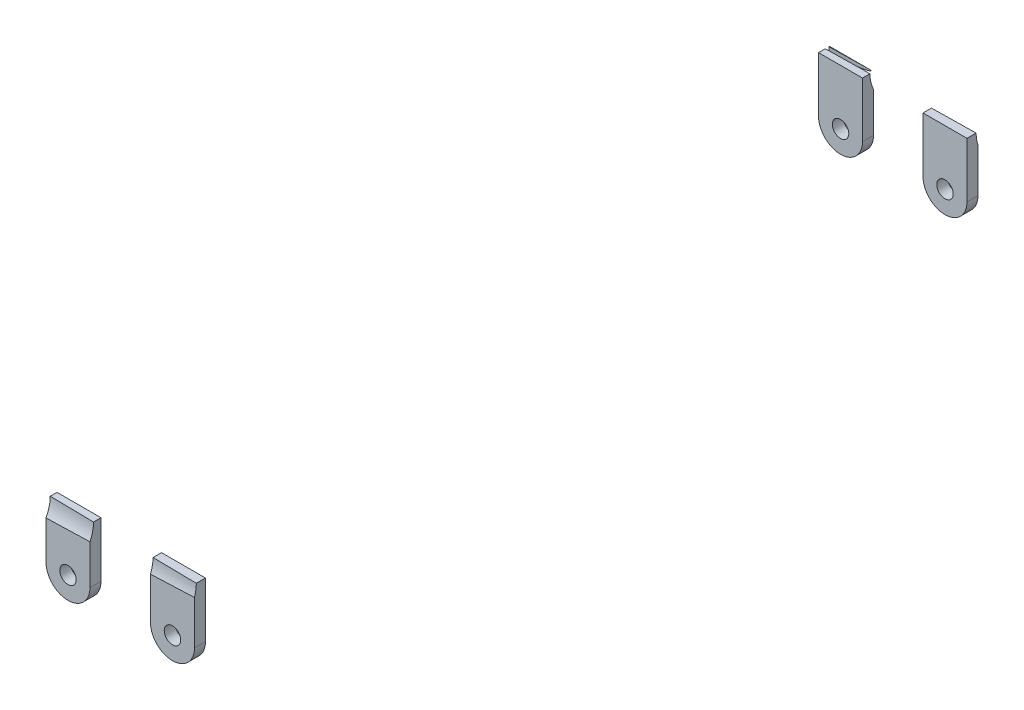
ISO-10303-21;
HEADER;
FILE_DESCRIPTION(('STEP AP214'),'2;1');
FILE_NAME('part.step','',(''),(''),'','','');
FILE_SCHEMA(('AUTOMOTIVE_DESIGN { 1 0 10303 214 1 1 1 1 }'));
ENDSEC;
DATA;
#1=APPLICATION_CONTEXT('core data for automotive mechanical design processes');
#2=APPLICATION_PROTOCOL_DEFINITION('international standard','automotive_design',2000,#1);
#3=PRODUCT_CONTEXT('',#1,'mechanical');
#4=PRODUCT('Part','Part','',(#3));
#5=PRODUCT_RELATED_PRODUCT_CATEGORY('part','',(#4));
#6=PRODUCT_DEFINITION_FORMATION('','',#4);
#7=PRODUCT_DEFINITION_CONTEXT('part definition',#1,'design');
#8=PRODUCT_DEFINITION('design','',#6,#7);
#9=PRODUCT_DEFINITION_SHAPE('','',#8);
#10=(LENGTH_UNIT() NAMED_UNIT(*) SI_UNIT(.MILLI.,.METRE.));
#11=(NAMED_UNIT(*) PLANE_ANGLE_UNIT() SI_UNIT($,.RADIAN.));
#12=(NAMED_UNIT(*) SI_UNIT($,.STERADIAN.) SOLID_ANGLE_UNIT());
#13=UNCERTAINTY_MEASURE_WITH_UNIT(LENGTH_MEASURE(1.E-05),#10,'distance_accuracy_value','');
#14=(GEOMETRIC_REPRESENTATION_CONTEXT(3) GLOBAL_UNCERTAINTY_ASSIGNED_CONTEXT((#13)) GLOBAL_UNIT_ASSIGNED_CONTEXT((#10,
#11,#12)) REPRESENTATION_CONTEXT('',''));
#15=CARTESIAN_POINT('',(0.,0.,0.));
#16=DIRECTION('',(0.,0.,1.));
#17=DIRECTION('',(1.,0.,0.));
#18=AXIS2_PLACEMENT_3D('',#15,#16,#17);
#19=CARTESIAN_POINT('',(-0.0344409514116402,179.851831387508,142.5));
#20=DIRECTION('',(-0.000191496247296726,0.999999981664593,0.));
#21=DIRECTION('',(-0.999999981664593,-0.000191496247296726,0.));
#22=AXIS2_PLACEMENT_3D('',#19,#20,#21);
#23=PLANE('',#22);
#24=DIRECTION('',(0.,0.,-1.));
#25=VECTOR('',#24,1.);
#26=CARTESIAN_POINT('',(1019.,180.046972662395,142.5));
#27=LINE('',#26,#25);
#28=CARTESIAN_POINT('',(1019.,180.046972662395,141.213051029782));
#29=VERTEX_POINT('',#28);
#30=CARTESIAN_POINT('',(1019.,180.046972662395,138.5));
#31=VERTEX_POINT('',#30);
#32=EDGE_CURVE('E124',#29,#31,#27,.T.);
#33=ORIENTED_EDGE('',*,*,#32,.T.);
#34=DIRECTION('',(-0.999999981664593,-0.000191496247296726,0.));
#35=VECTOR('',#34,1.);
#36=CARTESIAN_POINT('',(-0.0344409514116402,179.851831387508,138.5));
#37=LINE('',#36,#35);
#38=CARTESIAN_POINT('',(1003.,180.043908722382,138.5));
#39=VERTEX_POINT('',#38);
#40=EDGE_CURVE('E128',#31,#39,#37,.T.);
#41=ORIENTED_EDGE('',*,*,#40,.T.);
#42=DIRECTION('',(0.,0.,-1.));
#43=VECTOR('',#42,1.);
#44=CARTESIAN_POINT('',(1003.,180.043908722382,142.5));
#45=LINE('',#44,#43);
#46=CARTESIAN_POINT('',(1003.,180.043908722382,140.957704393656));
#47=VERTEX_POINT('',#46);
#48=EDGE_CURVE('E137',#47,#39,#45,.T.);
#49=ORIENTED_EDGE('',*,*,#48,.F.);
#50=CARTESIAN_POINT('',(1019.001,180.046972853891,141.213066988947));
#51=CARTESIAN_POINT('',(1016.334,180.04646213339,141.170503896537));
#52=CARTESIAN_POINT('',(1013.667,180.045951412889,141.127940804128));
#53=CARTESIAN_POINT('',(1008.333,180.044929971887,141.04281461931));
#54=CARTESIAN_POINT('',(1005.666,180.044419251386,141.000251526901));
#55=CARTESIAN_POINT('',(1002.999,180.043908530885,140.957688434491));
#56=B_SPLINE_CURVE_WITH_KNOTS('',3,(#50,#51,#52,#53,#54,#55),.UNSPECIFIED.,.F.,.F.,(4,2,4),(0.,
8.00201898892002,16.00403797784),.UNSPECIFIED.);
#57=EDGE_CURVE('E108',#29,#47,#56,.T.);
#58=ORIENTED_EDGE('',*,*,#57,.F.);
#59=EDGE_LOOP('',(#33,#41,#49,#58));
#60=FACE_BOUND('',#59,.T.);
#61=ADVANCED_FACE('F50',(#60),#23,.T.);
#62=CARTESIAN_POINT('',(1019.,0.,142.5));
#63=DIRECTION('',(1.,0.,0.));
#64=DIRECTION('',(0.,0.,1.));
#65=AXIS2_PLACEMENT_3D('',#62,#63,#64);
#66=PLANE('',#65);
#67=DIRECTION('',(0.,1.,0.));
#68=VECTOR('',#67,1.);
#69=CARTESIAN_POINT('',(1019.,0.,142.5));
#70=LINE('',#69,#68);
#71=CARTESIAN_POINT('',(1019.,160.,142.5));
#72=VERTEX_POINT('',#71);
#73=CARTESIAN_POINT('',(1019.,174.471738830205,142.5));
#74=VERTEX_POINT('',#73);
#75=EDGE_CURVE('E102',#72,#74,#70,.T.);
#76=ORIENTED_EDGE('',*,*,#75,.F.);
#77=DIRECTION('',(0.,0.,-1.));
#78=VECTOR('',#77,1.);
#79=CARTESIAN_POINT('',(1019.,160.,142.5));
#80=LINE('',#79,#78);
#81=CARTESIAN_POINT('',(1019.,160.,138.5));
#82=VERTEX_POINT('',#81);
#83=EDGE_CURVE('E112',#72,#82,#80,.T.);
#84=ORIENTED_EDGE('',*,*,#83,.T.);
#85=DIRECTION('',(0.,1.,0.));
#86=VECTOR('',#85,1.);
#87=CARTESIAN_POINT('',(1019.,0.,138.5));
#88=LINE('',#87,#86);
#89=EDGE_CURVE('E131',#82,#31,#88,.T.);
#90=ORIENTED_EDGE('',*,*,#89,.T.);
#91=ORIENTED_EDGE('',*,*,#32,.F.);
#92=CARTESIAN_POINT('',(1019.,180.042097589936,153.914667288973));
#93=DIRECTION('',(-1.,0.,0.));
#94=DIRECTION('',(0.,-0.0107531886792747,-0.9999421827952));
#95=AXIS2_PLACEMENT_3D('',#92,#93,#94);
#96=ELLIPSE('',#95,12.7016173954027,12.7);
#97=EDGE_CURVE('E69',#74,#29,#96,.F.);
#98=ORIENTED_EDGE('',*,*,#97,.F.);
#99=EDGE_LOOP('',(#76,#84,#90,#91,#98));
#100=FACE_BOUND('',#99,.T.);
#101=ADVANCED_FACE('F149',(#100),#66,.T.);
#102=CARTESIAN_POINT('',(1011.,160.,142.5));
#103=DIRECTION('',(0.,0.,-1.));
#104=DIRECTION('',(1.,0.,0.));
#105=AXIS2_PLACEMENT_3D('',#102,#103,#104);
#106=CYLINDRICAL_SURFACE('',#105,7.99999999999999);
#107=CARTESIAN_POINT('',(1011.,160.,138.5));
#108=DIRECTION('',(0.,0.,-1.));
#109=DIRECTION('',(-1.,0.,0.));
#110=AXIS2_PLACEMENT_3D('',#107,#108,#109);
#111=CIRCLE('',#110,7.99999999999999);
#112=CARTESIAN_POINT('',(1003.,160.,138.5));
#113=VERTEX_POINT('',#112);
#114=EDGE_CURVE('E126',#82,#113,#111,.T.);
#115=ORIENTED_EDGE('',*,*,#114,.F.);
#116=ORIENTED_EDGE('',*,*,#83,.F.);
#117=CARTESIAN_POINT('',(1011.,160.,142.5));
#118=DIRECTION('',(0.,0.,-1.));
#119=DIRECTION('',(-1.,0.,0.));
#120=AXIS2_PLACEMENT_3D('',#117,#118,#119);
#121=CIRCLE('',#120,7.99999999999999);
#122=CARTESIAN_POINT('',(1003.,160.,142.5));
#123=VERTEX_POINT('',#122);
#124=EDGE_CURVE('E103',#72,#123,#121,.T.);
#125=ORIENTED_EDGE('',*,*,#124,.T.);
#126=DIRECTION('',(0.,0.,-1.));
#127=VECTOR('',#126,1.);
#128=CARTESIAN_POINT('',(1003.,160.,142.5));
#129=LINE('',#128,#127);
#130=EDGE_CURVE('E115',#123,#113,#129,.T.);
#131=ORIENTED_EDGE('',*,*,#130,.T.);
#132=EDGE_LOOP('',(#115,#116,#125,#131));
#133=FACE_BOUND('',#132,.T.);
#134=ADVANCED_FACE('F164',(#133),#106,.T.);
#135=CARTESIAN_POINT('',(1003.,1.1111143132034E-11,142.5));
#136=DIRECTION('',(-1.,0.,0.));
#137=DIRECTION('',(0.,-1.,0.));
#138=AXIS2_PLACEMENT_3D('',#135,#136,#137);
#139=PLANE('',#138);
#140=ORIENTED_EDGE('',*,*,#48,.T.);
#141=DIRECTION('',(0.,-1.,0.));
#142=VECTOR('',#141,1.);
#143=CARTESIAN_POINT('',(1003.,1.1111143132034E-11,138.5));
#144=LINE('',#143,#142);
#145=EDGE_CURVE('E60',#39,#113,#144,.T.);
#146=ORIENTED_EDGE('',*,*,#145,.T.);
#147=ORIENTED_EDGE('',*,*,#130,.F.);
#148=DIRECTION('',(0.,-1.,0.));
#149=VECTOR('',#148,1.);
#150=CARTESIAN_POINT('',(1003.,1.1111143132034E-11,142.5));
#151=LINE('',#150,#149);
#152=CARTESIAN_POINT('',(1003.,173.973740307988,142.5));
#153=VERTEX_POINT('',#152);
#154=EDGE_CURVE('E54',#153,#123,#151,.T.);
#155=ORIENTED_EDGE('',*,*,#154,.F.);
#156=CARTESIAN_POINT('',(1003.,180.039351641896,153.659320771818));
#157=DIRECTION('',(1.,0.,0.));
#158=DIRECTION('',(0.,-0.0107531886785806,-0.999942182795207));
#159=AXIS2_PLACEMENT_3D('',#156,#157,#158);
#160=ELLIPSE('',#159,12.7016173954027,12.7);
#161=EDGE_CURVE('E106',#47,#153,#160,.F.);
#162=ORIENTED_EDGE('',*,*,#161,.F.);
#163=EDGE_LOOP('',(#140,#146,#147,#155,#162));
#164=FACE_BOUND('',#163,.T.);
#165=ADVANCED_FACE('F52',(#164),#139,.T.);
#166=CARTESIAN_POINT('',(1011.,160.,142.5));
#167=DIRECTION('',(0.,0.,-1.));
#168=DIRECTION('',(1.,0.,0.));
#169=AXIS2_PLACEMENT_3D('',#166,#167,#168);
#170=CYLINDRICAL_SURFACE('',#169,3.00000000000017);
#171=CARTESIAN_POINT('',(1011.,160.,142.5));
#172=DIRECTION('',(0.,0.,-1.));
#173=DIRECTION('',(-1.,0.,0.));
#174=AXIS2_PLACEMENT_3D('',#171,#172,#173);
#175=CIRCLE('',#174,3.00000000000017);
#176=CARTESIAN_POINT('',(1008.,160.,142.5));
#177=VERTEX_POINT('',#176);
#178=EDGE_CURVE('E104',#177,#177,#175,.T.);
#179=ORIENTED_EDGE('',*,*,#178,.F.);
#180=EDGE_LOOP('',(#179));
#181=FACE_BOUND('',#180,.T.);
#182=CARTESIAN_POINT('',(1011.,160.,138.5));
#183=DIRECTION('',(0.,0.,-1.));
#184=DIRECTION('',(-1.,0.,0.));
#185=AXIS2_PLACEMENT_3D('',#182,#183,#184);
#186=CIRCLE('',#185,3.00000000000017);
#187=CARTESIAN_POINT('',(1008.,160.,138.5));
#188=VERTEX_POINT('',#187);
#189=EDGE_CURVE('E12',#188,#188,#186,.T.);
#190=ORIENTED_EDGE('',*,*,#189,.T.);
#191=EDGE_LOOP('',(#190));
#192=FACE_BOUND('',#191,.T.);
#193=ADVANCED_FACE('F153',(#181,#192),#170,.F.);
#194=CARTESIAN_POINT('',(0.,0.,142.5));
#195=DIRECTION('',(0.,0.,1.));
#196=DIRECTION('',(-1.,0.,0.));
#197=AXIS2_PLACEMENT_3D('',#194,#195,#196);
#198=PLANE('',#197);
#199=ORIENTED_EDGE('',*,*,#154,.T.);
#200=ORIENTED_EDGE('',*,*,#124,.F.);
#201=ORIENTED_EDGE('',*,*,#75,.T.);
#202=CARTESIAN_POINT('',(303.757518300032,179.919346421737,142.5));
#203=DIRECTION('',(0.,0.,-1.));
#204=DIRECTION('',(-0.999999985272988,-0.000171621750010428,0.));
#205=AXIS2_PLACEMENT_3D('',#202,#203,#204);
#206=ELLIPSE('',#205,795.882711033291,12.7);
#207=EDGE_CURVE('E94',#153,#74,#206,.F.);
#208=ORIENTED_EDGE('',*,*,#207,.F.);
#209=EDGE_LOOP('',(#199,#200,#201,#208));
#210=FACE_BOUND('',#209,.T.);
#211=ORIENTED_EDGE('',*,*,#178,.T.);
#212=EDGE_LOOP('',(#211));
#213=FACE_BOUND('',#212,.T.);
#214=ADVANCED_FACE('F97',(#210,#213),#198,.T.);
#215=CARTESIAN_POINT('',(0.,0.,138.5));
#216=DIRECTION('',(0.,0.,1.));
#217=DIRECTION('',(-1.,0.,0.));
#218=AXIS2_PLACEMENT_3D('',#215,#216,#217);
#219=PLANE('',#218);
#220=ORIENTED_EDGE('',*,*,#89,.F.);
#221=ORIENTED_EDGE('',*,*,#114,.T.);
#222=ORIENTED_EDGE('',*,*,#145,.F.);
#223=ORIENTED_EDGE('',*,*,#40,.F.);
#224=EDGE_LOOP('',(#220,#221,#222,#223));
#225=FACE_BOUND('',#224,.T.);
#226=ORIENTED_EDGE('',*,*,#189,.F.);
#227=EDGE_LOOP('',(#226));
#228=FACE_BOUND('',#227,.T.);
#229=ADVANCED_FACE('F152',(#225,#228),#219,.F.);
#230=CARTESIAN_POINT('',(1400.,180.107485477653,159.995106228733));
#231=DIRECTION('',(-0.999872662248254,-0.000171599898609785,-0.015957125118991));
#232=DIRECTION('',(0.015957125353932,0.,-0.999872676969642));
#233=AXIS2_PLACEMENT_3D('',#230,#231,#232);
#234=CYLINDRICAL_SURFACE('',#233,12.7);
#235=ORIENTED_EDGE('',*,*,#97,.T.);
#236=ORIENTED_EDGE('',*,*,#57,.T.);
#237=ORIENTED_EDGE('',*,*,#161,.T.);
#238=ORIENTED_EDGE('',*,*,#207,.T.);
#239=EDGE_LOOP('',(#235,#236,#237,#238));
#240=FACE_BOUND('',#239,.T.);
#241=ADVANCED_FACE('F107',(#240),#234,.F.);
#242=CLOSED_SHELL('',(#61,#101,#134,#165,#193,#214,#229,#241));
#243=MANIFOLD_SOLID_BREP('B2',#242);
#244=CARTESIAN_POINT('',(-0.0344409514116402,179.851831387508,142.5));
#245=DIRECTION('',(-0.000191496247296726,0.999999981664593,0.));
#246=DIRECTION('',(-0.999999981664593,-0.000191496247296726,0.));
#247=AXIS2_PLACEMENT_3D('',#244,#245,#246);
#248=PLANE('',#247);
#249=DIRECTION('',(0.,0.,-1.));
#250=VECTOR('',#249,1.);
#251=CARTESIAN_POINT('',(1057.,180.054249519925,142.5));
#252=LINE('',#251,#250);
#253=CARTESIAN_POINT('',(1057.,180.054249519925,141.819499322495));
#254=VERTEX_POINT('',#253);
#255=CARTESIAN_POINT('',(1057.,180.054249519925,138.5));
#256=VERTEX_POINT('',#255);
#257=EDGE_CURVE('E290',#254,#256,#252,.T.);
#258=ORIENTED_EDGE('',*,*,#257,.T.);
#259=DIRECTION('',(-0.999999981664593,-0.000191496247296726,0.));
#260=VECTOR('',#259,1.);
#261=CARTESIAN_POINT('',(-0.0344409514116402,179.851831387508,138.5));
#262=LINE('',#261,#260);
#263=CARTESIAN_POINT('',(1041.,180.051185579912,138.5));
#264=VERTEX_POINT('',#263);
#265=EDGE_CURVE('E298',#256,#264,#262,.T.);
#266=ORIENTED_EDGE('',*,*,#265,.T.);
#267=DIRECTION('',(0.,0.,-1.));
#268=VECTOR('',#267,1.);
#269=CARTESIAN_POINT('',(1041.,180.051185579912,142.5));
#270=LINE('',#269,#268);
#271=CARTESIAN_POINT('',(1041.,180.051185579912,141.564152667457));
#272=VERTEX_POINT('',#271);
#273=EDGE_CURVE('E309',#272,#264,#270,.T.);
#274=ORIENTED_EDGE('',*,*,#273,.F.);
#275=CARTESIAN_POINT('',(1057.001,180.054249711421,141.819515281662));
#276=CARTESIAN_POINT('',(1054.334,180.053738990921,141.7769521861));
#277=CARTESIAN_POINT('',(1051.667,180.05322827042,141.734389090538));
#278=CARTESIAN_POINT('',(1046.333,180.052206829418,141.649262899415));
#279=CARTESIAN_POINT('',(1043.666,180.051696108917,141.606699803853));
#280=CARTESIAN_POINT('',(1040.999,180.051185388416,141.564136708291));
#281=B_SPLINE_CURVE_WITH_KNOTS('',3,(#275,#276,#277,#278,#279,#280),.UNSPECIFIED.,.F.,.F.,(4,2,
4),(0.,8.00201898907094,16.0040379781419),.UNSPECIFIED.);
#282=EDGE_CURVE('E295',#254,#272,#281,.T.);
#283=ORIENTED_EDGE('',*,*,#282,.F.);
#284=EDGE_LOOP('',(#258,#266,#274,#283));
#285=FACE_BOUND('',#284,.T.);
#286=ADVANCED_FACE('F245',(#285),#248,.T.);
#287=CARTESIAN_POINT('',(1057.,0.,142.5));
#288=DIRECTION('',(1.,0.,0.));
#289=DIRECTION('',(0.,0.,1.));
#290=AXIS2_PLACEMENT_3D('',#287,#288,#289);
#291=PLANE('',#290);
#292=DIRECTION('',(0.,1.,0.));
#293=VECTOR('',#292,1.);
#294=CARTESIAN_POINT('',(1057.,0.,142.5));
#295=LINE('',#294,#293);
#296=CARTESIAN_POINT('',(1057.,160.,142.5));
#297=VERTEX_POINT('',#296);
#298=CARTESIAN_POINT('',(1057.,175.947417676455,142.5));
#299=VERTEX_POINT('',#298);
#300=EDGE_CURVE('E329',#297,#299,#295,.T.);
#301=ORIENTED_EDGE('',*,*,#300,.F.);
#302=DIRECTION('',(0.,0.,-1.));
#303=VECTOR('',#302,1.);
#304=CARTESIAN_POINT('',(1057.,160.,142.5));
#305=LINE('',#304,#303);
#306=CARTESIAN_POINT('',(1057.,160.,138.5));
#307=VERTEX_POINT('',#306);
#308=EDGE_CURVE('E253',#297,#307,#305,.T.);
#309=ORIENTED_EDGE('',*,*,#308,.T.);
#310=DIRECTION('',(0.,1.,0.));
#311=VECTOR('',#310,1.);
#312=CARTESIAN_POINT('',(1057.,0.,138.5));
#313=LINE('',#312,#311);
#314=EDGE_CURVE('E286',#307,#256,#313,.T.);
#315=ORIENTED_EDGE('',*,*,#314,.T.);
#316=ORIENTED_EDGE('',*,*,#257,.F.);
#317=CARTESIAN_POINT('',(1057.,180.048619216533,154.521115267217));
#318=DIRECTION('',(-1.,0.,0.));
#319=DIRECTION('',(0.,-0.0107531886792747,-0.9999421827952));
#320=AXIS2_PLACEMENT_3D('',#317,#318,#319);
#321=ELLIPSE('',#320,12.7016173954027,12.7);
#322=EDGE_CURVE('E339',#299,#254,#321,.F.);
#323=ORIENTED_EDGE('',*,*,#322,.F.);
#324=EDGE_LOOP('',(#301,#309,#315,#316,#323));
#325=FACE_BOUND('',#324,.T.);
#326=ADVANCED_FACE('F247',(#325),#291,.T.);
#327=CARTESIAN_POINT('',(1049.,160.,142.5));
#328=DIRECTION('',(0.,0.,-1.));
#329=DIRECTION('',(1.,0.,0.));
#330=AXIS2_PLACEMENT_3D('',#327,#328,#329);
#331=CYLINDRICAL_SURFACE('',#330,7.99999999999999);
#332=CARTESIAN_POINT('',(1049.,160.,138.5));
#333=DIRECTION('',(0.,0.,-1.));
#334=DIRECTION('',(-1.,0.,0.));
#335=AXIS2_PLACEMENT_3D('',#332,#333,#334);
#336=CIRCLE('',#335,7.99999999999999);
#337=CARTESIAN_POINT('',(1041.,160.,138.5));
#338=VERTEX_POINT('',#337);
#339=EDGE_CURVE('E294',#307,#338,#336,.T.);
#340=ORIENTED_EDGE('',*,*,#339,.F.);
#341=ORIENTED_EDGE('',*,*,#308,.F.);
#342=CARTESIAN_POINT('',(1049.,160.,142.5));
#343=DIRECTION('',(0.,0.,-1.));
#344=DIRECTION('',(-1.,0.,0.));
#345=AXIS2_PLACEMENT_3D('',#342,#343,#344);
#346=CIRCLE('',#345,7.99999999999999);
#347=CARTESIAN_POINT('',(1041.,160.,142.5));
#348=VERTEX_POINT('',#347);
#349=EDGE_CURVE('E322',#297,#348,#346,.T.);
#350=ORIENTED_EDGE('',*,*,#349,.T.);
#351=DIRECTION('',(0.,0.,-1.));
#352=VECTOR('',#351,1.);
#353=CARTESIAN_POINT('',(1041.,160.,142.5));
#354=LINE('',#353,#352);
#355=EDGE_CURVE('E312',#348,#338,#354,.T.);
#356=ORIENTED_EDGE('',*,*,#355,.T.);
#357=EDGE_LOOP('',(#340,#341,#350,#356));
#358=FACE_BOUND('',#357,.T.);
#359=ADVANCED_FACE('F321',(#358),#331,.T.);
#360=CARTESIAN_POINT('',(1041.,1.15279185265997E-11,142.5));
#361=DIRECTION('',(-1.,0.,0.));
#362=DIRECTION('',(0.,-1.,0.));
#363=AXIS2_PLACEMENT_3D('',#360,#361,#362);
#364=PLANE('',#363);
#365=ORIENTED_EDGE('',*,*,#273,.T.);
#366=DIRECTION('',(0.,-1.,0.));
#367=VECTOR('',#366,1.);
#368=CARTESIAN_POINT('',(1041.,1.15279185265997E-11,138.5));
#369=LINE('',#368,#367);
#370=EDGE_CURVE('E301',#264,#338,#369,.T.);
#371=ORIENTED_EDGE('',*,*,#370,.T.);
#372=ORIENTED_EDGE('',*,*,#355,.F.);
#373=DIRECTION('',(0.,-1.,0.));
#374=VECTOR('',#373,1.);
#375=CARTESIAN_POINT('',(1041.,1.15279185265997E-11,142.5));
#376=LINE('',#375,#374);
#377=CARTESIAN_POINT('',(1041.,175.261289280109,142.5));
#378=VERTEX_POINT('',#377);
#379=EDGE_CURVE('E266',#378,#348,#376,.T.);
#380=ORIENTED_EDGE('',*,*,#379,.F.);
#381=CARTESIAN_POINT('',(1041.,180.045873268492,154.265768750062));
#382=DIRECTION('',(1.,0.,0.));
#383=DIRECTION('',(0.,-0.0107531886785809,-0.999942182795207));
#384=AXIS2_PLACEMENT_3D('',#381,#382,#383);
#385=ELLIPSE('',#384,12.7016173954027,12.7);
#386=EDGE_CURVE('E417',#272,#378,#385,.F.);
#387=ORIENTED_EDGE('',*,*,#386,.F.);
#388=EDGE_LOOP('',(#365,#371,#372,#380,#387));
#389=FACE_BOUND('',#388,.T.);
#390=ADVANCED_FACE('F350',(#389),#364,.T.);
#391=CARTESIAN_POINT('',(1049.,160.,142.5));
#392=DIRECTION('',(0.,0.,-1.));
#393=DIRECTION('',(1.,0.,0.));
#394=AXIS2_PLACEMENT_3D('',#391,#392,#393);
#395=CYLINDRICAL_SURFACE('',#394,2.99999999999971);
#396=CARTESIAN_POINT('',(1049.,160.,142.5));
#397=DIRECTION('',(0.,0.,-1.));
#398=DIRECTION('',(-1.,0.,0.));
#399=AXIS2_PLACEMENT_3D('',#396,#397,#398);
#400=CIRCLE('',#399,2.99999999999971);
#401=CARTESIAN_POINT('',(1046.,160.,142.5));
#402=VERTEX_POINT('',#401);
#403=EDGE_CURVE('E310',#402,#402,#400,.T.);
#404=ORIENTED_EDGE('',*,*,#403,.F.);
#405=EDGE_LOOP('',(#404));
#406=FACE_BOUND('',#405,.T.);
#407=CARTESIAN_POINT('',(1049.,160.,138.5));
#408=DIRECTION('',(0.,0.,-1.));
#409=DIRECTION('',(-1.,0.,0.));
#410=AXIS2_PLACEMENT_3D('',#407,#408,#409);
#411=CIRCLE('',#410,2.99999999999971);
#412=CARTESIAN_POINT('',(1046.,160.,138.5));
#413=VERTEX_POINT('',#412);
#414=EDGE_CURVE('E305',#413,#413,#411,.T.);
#415=ORIENTED_EDGE('',*,*,#414,.T.);
#416=EDGE_LOOP('',(#415));
#417=FACE_BOUND('',#416,.T.);
#418=ADVANCED_FACE('F348',(#406,#417),#395,.F.);
#419=CARTESIAN_POINT('',(0.,0.,142.5));
#420=DIRECTION('',(0.,0.,1.));
#421=DIRECTION('',(-1.,0.,0.));
#422=AXIS2_PLACEMENT_3D('',#419,#420,#421);
#423=PLANE('',#422);
#424=ORIENTED_EDGE('',*,*,#379,.T.);
#425=ORIENTED_EDGE('',*,*,#349,.F.);
#426=ORIENTED_EDGE('',*,*,#300,.T.);
#427=CARTESIAN_POINT('',(303.757518300032,179.919346421737,142.5));
#428=DIRECTION('',(0.,0.,-1.));
#429=DIRECTION('',(-0.999999985272988,-0.000171621750010428,0.));
#430=AXIS2_PLACEMENT_3D('',#427,#428,#429);
#431=ELLIPSE('',#430,795.882711033291,12.7);
#432=EDGE_CURVE('E48',#378,#299,#431,.F.);
#433=ORIENTED_EDGE('',*,*,#432,.F.);
#434=EDGE_LOOP('',(#424,#425,#426,#433));
#435=FACE_BOUND('',#434,.T.);
#436=ORIENTED_EDGE('',*,*,#403,.T.);
#437=EDGE_LOOP('',(#436));
#438=FACE_BOUND('',#437,.T.);
#439=ADVANCED_FACE('F383',(#435,#438),#423,.T.);
#440=CARTESIAN_POINT('',(0.,0.,138.5));
#441=DIRECTION('',(0.,0.,1.));
#442=DIRECTION('',(-1.,0.,0.));
#443=AXIS2_PLACEMENT_3D('',#440,#441,#442);
#444=PLANE('',#443);
#445=ORIENTED_EDGE('',*,*,#314,.F.);
#446=ORIENTED_EDGE('',*,*,#339,.T.);
#447=ORIENTED_EDGE('',*,*,#370,.F.);
#448=ORIENTED_EDGE('',*,*,#265,.F.);
#449=EDGE_LOOP('',(#445,#446,#447,#448));
#450=FACE_BOUND('',#449,.T.);
#451=ORIENTED_EDGE('',*,*,#414,.F.);
#452=EDGE_LOOP('',(#451));
#453=FACE_BOUND('',#452,.T.);
#454=ADVANCED_FACE('F299',(#450,#453),#444,.F.);
#455=CARTESIAN_POINT('',(1400.,180.107485477653,159.995106228733));
#456=DIRECTION('',(-0.999872662248254,-0.000171599898609785,-0.015957125118991));
#457=DIRECTION('',(0.015957125353932,0.,-0.999872676969642));
#458=AXIS2_PLACEMENT_3D('',#455,#456,#457);
#459=CYLINDRICAL_SURFACE('',#458,12.7);
#460=ORIENTED_EDGE('',*,*,#322,.T.);
#461=ORIENTED_EDGE('',*,*,#282,.T.);
#462=ORIENTED_EDGE('',*,*,#386,.T.);
#463=ORIENTED_EDGE('',*,*,#432,.T.);
#464=EDGE_LOOP('',(#460,#461,#462,#463));
#465=FACE_BOUND('',#464,.T.);
#466=ADVANCED_FACE('F341',(#465),#459,.F.);
#467=CLOSED_SHELL('',(#286,#326,#359,#390,#418,#439,#454,#466));
#468=MANIFOLD_SOLID_BREP('B6',#467);
#469=CARTESIAN_POINT('',(-0.0344409514116402,179.851831387508,-142.5));
#470=DIRECTION('',(-0.000191496247296726,0.999999981664593,0.));
#471=DIRECTION('',(-0.999999981664593,-0.000191496247296726,0.));
#472=AXIS2_PLACEMENT_3D('',#469,#470,#471);
#473=PLANE('',#472);
#474=DIRECTION('',(0.,0.,1.));
#475=VECTOR('',#474,1.);
#476=CARTESIAN_POINT('',(1019.,180.046972662395,-142.5));
#477=LINE('',#476,#475);
#478=CARTESIAN_POINT('',(1019.,180.046972662395,-141.213051029782));
#479=VERTEX_POINT('',#478);
#480=CARTESIAN_POINT('',(1019.,180.046972662395,-138.5));
#481=VERTEX_POINT('',#480);
#482=EDGE_CURVE('E513',#479,#481,#477,.T.);
#483=ORIENTED_EDGE('',*,*,#482,.F.);
#484=CARTESIAN_POINT('',(1019.001,180.046972853891,-141.213066988947));
#485=CARTESIAN_POINT('',(1016.334,180.04646213339,-141.170503896537));
#486=CARTESIAN_POINT('',(1013.667,180.045951412889,-141.127940804128));
#487=CARTESIAN_POINT('',(1008.333,180.044929971887,-141.04281461931));
#488=CARTESIAN_POINT('',(1005.666,180.044419251386,-141.000251526901));
#489=CARTESIAN_POINT('',(1002.999,180.043908530885,-140.957688434491));
#490=B_SPLINE_CURVE_WITH_KNOTS('',3,(#484,#485,#486,#487,#488,#489),.UNSPECIFIED.,.F.,.F.,(4,2,
4),(0.,8.00201898892002,16.00403797784),.UNSPECIFIED.);
#491=CARTESIAN_POINT('',(1003.,180.043908722382,-140.957704393656));
#492=VERTEX_POINT('',#491);
#493=EDGE_CURVE('E459',#479,#492,#490,.T.);
#494=ORIENTED_EDGE('',*,*,#493,.T.);
#495=DIRECTION('',(0.,0.,1.));
#496=VECTOR('',#495,1.);
#497=CARTESIAN_POINT('',(1003.,180.043908722382,-142.5));
#498=LINE('',#497,#496);
#499=CARTESIAN_POINT('',(1003.,180.043908722382,-138.5));
#500=VERTEX_POINT('',#499);
#501=EDGE_CURVE('E499',#492,#500,#498,.T.);
#502=ORIENTED_EDGE('',*,*,#501,.T.);
#503=DIRECTION('',(-0.999999981664593,-0.000191496247296726,0.));
#504=VECTOR('',#503,1.);
#505=CARTESIAN_POINT('',(-0.0344409514116402,179.851831387508,-138.5));
#506=LINE('',#505,#504);
#507=EDGE_CURVE('E516',#481,#500,#506,.T.);
#508=ORIENTED_EDGE('',*,*,#507,.F.);
#509=EDGE_LOOP('',(#483,#494,#502,#508));
#510=FACE_BOUND('',#509,.T.);
#511=ADVANCED_FACE('F440',(#510),#473,.T.);
#512=CARTESIAN_POINT('',(1019.,0.,-142.5));
#513=DIRECTION('',(1.,0.,0.));
#514=DIRECTION('',(0.,0.,-1.));
#515=AXIS2_PLACEMENT_3D('',#512,#513,#514);
#516=PLANE('',#515);
#517=DIRECTION('',(0.,1.,0.));
#518=VECTOR('',#517,1.);
#519=CARTESIAN_POINT('',(1019.,0.,-142.5));
#520=LINE('',#519,#518);
#521=CARTESIAN_POINT('',(1019.,160.,-142.5));
#522=VERTEX_POINT('',#521);
#523=CARTESIAN_POINT('',(1019.,174.471738830205,-142.5));
#524=VERTEX_POINT('',#523);
#525=EDGE_CURVE('E526',#522,#524,#520,.T.);
#526=ORIENTED_EDGE('',*,*,#525,.T.);
#527=CARTESIAN_POINT('',(1019.,180.042097589936,-153.914667288973));
#528=DIRECTION('',(1.,0.,0.));
#529=DIRECTION('',(0.,-0.0107531886792747,0.9999421827952));
#530=AXIS2_PLACEMENT_3D('',#527,#528,#529);
#531=ELLIPSE('',#530,12.7016173954027,12.7);
#532=EDGE_CURVE('E482',#524,#479,#531,.F.);
#533=ORIENTED_EDGE('',*,*,#532,.T.);
#534=ORIENTED_EDGE('',*,*,#482,.T.);
#535=DIRECTION('',(0.,1.,0.));
#536=VECTOR('',#535,1.);
#537=CARTESIAN_POINT('',(1019.,0.,-138.5));
#538=LINE('',#537,#536);
#539=CARTESIAN_POINT('',(1019.,160.,-138.5));
#540=VERTEX_POINT('',#539);
#541=EDGE_CURVE('E519',#540,#481,#538,.T.);
#542=ORIENTED_EDGE('',*,*,#541,.F.);
#543=DIRECTION('',(0.,0.,1.));
#544=VECTOR('',#543,1.);
#545=CARTESIAN_POINT('',(1019.,160.,-142.5));
#546=LINE('',#545,#544);
#547=EDGE_CURVE('E500',#522,#540,#546,.T.);
#548=ORIENTED_EDGE('',*,*,#547,.F.);
#549=EDGE_LOOP('',(#526,#533,#534,#542,#548));
#550=FACE_BOUND('',#549,.T.);
#551=ADVANCED_FACE('F550',(#550),#516,.T.);
#552=CARTESIAN_POINT('',(1011.,160.,-142.5));
#553=DIRECTION('',(0.,0.,1.));
#554=DIRECTION('',(1.,0.,0.));
#555=AXIS2_PLACEMENT_3D('',#552,#553,#554);
#556=CYLINDRICAL_SURFACE('',#555,7.99999999999999);
#557=CARTESIAN_POINT('',(1011.,160.,-138.5));
#558=DIRECTION('',(0.,0.,-1.));
#559=DIRECTION('',(-1.,0.,0.));
#560=AXIS2_PLACEMENT_3D('',#557,#558,#559);
#561=CIRCLE('',#560,7.99999999999999);
#562=CARTESIAN_POINT('',(1003.,160.,-138.5));
#563=VERTEX_POINT('',#562);
#564=EDGE_CURVE('E514',#540,#563,#561,.T.);
#565=ORIENTED_EDGE('',*,*,#564,.T.);
#566=DIRECTION('',(0.,0.,1.));
#567=VECTOR('',#566,1.);
#568=CARTESIAN_POINT('',(1003.,160.,-142.5));
#569=LINE('',#568,#567);
#570=CARTESIAN_POINT('',(1003.,160.,-142.5));
#571=VERTEX_POINT('',#570);
#572=EDGE_CURVE('E506',#571,#563,#569,.T.);
#573=ORIENTED_EDGE('',*,*,#572,.F.);
#574=CARTESIAN_POINT('',(1011.,160.,-142.5));
#575=DIRECTION('',(0.,0.,-1.));
#576=DIRECTION('',(-1.,0.,0.));
#577=AXIS2_PLACEMENT_3D('',#574,#575,#576);
#578=CIRCLE('',#577,7.99999999999999);
#579=EDGE_CURVE('E492',#522,#571,#578,.T.);
#580=ORIENTED_EDGE('',*,*,#579,.F.);
#581=ORIENTED_EDGE('',*,*,#547,.T.);
#582=EDGE_LOOP('',(#565,#573,#580,#581));
#583=FACE_BOUND('',#582,.T.);
#584=ADVANCED_FACE('F555',(#583),#556,.T.);
#585=CARTESIAN_POINT('',(1003.,1.1111143132034E-11,-142.5));
#586=DIRECTION('',(-1.,0.,0.));
#587=DIRECTION('',(0.,-1.,0.));
#588=AXIS2_PLACEMENT_3D('',#585,#586,#587);
#589=PLANE('',#588);
#590=ORIENTED_EDGE('',*,*,#501,.F.);
#591=CARTESIAN_POINT('',(1003.,180.039351641896,-153.659320771818));
#592=DIRECTION('',(-1.,0.,0.));
#593=DIRECTION('',(0.,-0.0107531886785806,0.999942182795207));
#594=AXIS2_PLACEMENT_3D('',#591,#592,#593);
#595=ELLIPSE('',#594,12.7016173954027,12.7);
#596=CARTESIAN_POINT('',(1003.,173.973740307988,-142.5));
#597=VERTEX_POINT('',#596);
#598=EDGE_CURVE('E487',#492,#597,#595,.F.);
#599=ORIENTED_EDGE('',*,*,#598,.T.);
#600=DIRECTION('',(0.,-1.,0.));
#601=VECTOR('',#600,1.);
#602=CARTESIAN_POINT('',(1003.,1.1111143132034E-11,-142.5));
#603=LINE('',#602,#601);
#604=EDGE_CURVE('E444',#597,#571,#603,.T.);
#605=ORIENTED_EDGE('',*,*,#604,.T.);
#606=ORIENTED_EDGE('',*,*,#572,.T.);
#607=DIRECTION('',(0.,-1.,0.));
#608=VECTOR('',#607,1.);
#609=CARTESIAN_POINT('',(1003.,1.1111143132034E-11,-138.5));
#610=LINE('',#609,#608);
#611=EDGE_CURVE('E450',#500,#563,#610,.T.);
#612=ORIENTED_EDGE('',*,*,#611,.F.);
#613=EDGE_LOOP('',(#590,#599,#605,#606,#612));
#614=FACE_BOUND('',#613,.T.);
#615=ADVANCED_FACE('F442',(#614),#589,.T.);
#616=CARTESIAN_POINT('',(1011.,160.,-142.5));
#617=DIRECTION('',(0.,0.,1.));
#618=DIRECTION('',(1.,0.,0.));
#619=AXIS2_PLACEMENT_3D('',#616,#617,#618);
#620=CYLINDRICAL_SURFACE('',#619,3.00000000000017);
#621=CARTESIAN_POINT('',(1011.,160.,-142.5));
#622=DIRECTION('',(0.,0.,-1.));
#623=DIRECTION('',(-1.,0.,0.));
#624=AXIS2_PLACEMENT_3D('',#621,#622,#623);
#625=CIRCLE('',#624,3.00000000000017);
#626=CARTESIAN_POINT('',(1008.,160.,-142.5));
#627=VERTEX_POINT('',#626);
#628=EDGE_CURVE('E493',#627,#627,#625,.T.);
#629=ORIENTED_EDGE('',*,*,#628,.T.);
#630=EDGE_LOOP('',(#629));
#631=FACE_BOUND('',#630,.T.);
#632=CARTESIAN_POINT('',(1011.,160.,-138.5));
#633=DIRECTION('',(0.,0.,-1.));
#634=DIRECTION('',(-1.,0.,0.));
#635=AXIS2_PLACEMENT_3D('',#632,#633,#634);
#636=CIRCLE('',#635,3.00000000000017);
#637=CARTESIAN_POINT('',(1008.,160.,-138.5));
#638=VERTEX_POINT('',#637);
#639=EDGE_CURVE('E243',#638,#638,#636,.T.);
#640=ORIENTED_EDGE('',*,*,#639,.F.);
#641=EDGE_LOOP('',(#640));
#642=FACE_BOUND('',#641,.T.);
#643=ADVANCED_FACE('F542',(#631,#642),#620,.F.);
#644=CARTESIAN_POINT('',(0.,0.,-142.5));
#645=DIRECTION('',(0.,0.,-1.));
#646=DIRECTION('',(-1.,0.,0.));
#647=AXIS2_PLACEMENT_3D('',#644,#645,#646);
#648=PLANE('',#647);
#649=ORIENTED_EDGE('',*,*,#604,.F.);
#650=CARTESIAN_POINT('',(303.757518300032,179.919346421737,-142.5));
#651=DIRECTION('',(0.,0.,-1.));
#652=DIRECTION('',(-0.999999985272988,-0.000171621750010428,0.));
#653=AXIS2_PLACEMENT_3D('',#650,#651,#652);
#654=ELLIPSE('',#653,795.882711033291,12.7);
#655=EDGE_CURVE('E484',#597,#524,#654,.F.);
#656=ORIENTED_EDGE('',*,*,#655,.T.);
#657=ORIENTED_EDGE('',*,*,#525,.F.);
#658=ORIENTED_EDGE('',*,*,#579,.T.);
#659=EDGE_LOOP('',(#649,#656,#657,#658));
#660=FACE_BOUND('',#659,.T.);
#661=ORIENTED_EDGE('',*,*,#628,.F.);
#662=EDGE_LOOP('',(#661));
#663=FACE_BOUND('',#662,.T.);
#664=ADVANCED_FACE('F502',(#660,#663),#648,.T.);
#665=CARTESIAN_POINT('',(0.,0.,-138.5));
#666=DIRECTION('',(0.,0.,-1.));
#667=DIRECTION('',(-1.,0.,0.));
#668=AXIS2_PLACEMENT_3D('',#665,#666,#667);
#669=PLANE('',#668);
#670=ORIENTED_EDGE('',*,*,#541,.T.);
#671=ORIENTED_EDGE('',*,*,#507,.T.);
#672=ORIENTED_EDGE('',*,*,#611,.T.);
#673=ORIENTED_EDGE('',*,*,#564,.F.);
#674=EDGE_LOOP('',(#670,#671,#672,#673));
#675=FACE_BOUND('',#674,.T.);
#676=ORIENTED_EDGE('',*,*,#639,.T.);
#677=EDGE_LOOP('',(#676));
#678=FACE_BOUND('',#677,.T.);
#679=ADVANCED_FACE('F539',(#675,#678),#669,.F.);
#680=CARTESIAN_POINT('',(1400.,180.107485477653,-159.995106228733));
#681=DIRECTION('',(-0.999872662248254,-0.000171599898609785,0.015957125118991));
#682=DIRECTION('',(0.015957125353932,0.,0.999872676969642));
#683=AXIS2_PLACEMENT_3D('',#680,#681,#682);
#684=CYLINDRICAL_SURFACE('',#683,12.7);
#685=ORIENTED_EDGE('',*,*,#532,.F.);
#686=ORIENTED_EDGE('',*,*,#655,.F.);
#687=ORIENTED_EDGE('',*,*,#598,.F.);
#688=ORIENTED_EDGE('',*,*,#493,.F.);
#689=EDGE_LOOP('',(#685,#686,#687,#688));
#690=FACE_BOUND('',#689,.T.);
#691=ADVANCED_FACE('F486',(#690),#684,.F.);
#692=CLOSED_SHELL('',(#511,#551,#584,#615,#643,#664,#679,#691));
#693=MANIFOLD_SOLID_BREP('B42',#692);
#694=CARTESIAN_POINT('',(0.,0.,-142.5));
#695=DIRECTION('',(0.,0.,-1.));
#696=DIRECTION('',(-1.,0.,0.));
#697=AXIS2_PLACEMENT_3D('',#694,#695,#696);
#698=PLANE('',#697);
#699=CARTESIAN_POINT('',(303.757518300032,179.919346421737,-142.5));
#700=DIRECTION('',(0.,0.,-1.));
#701=DIRECTION('',(-0.999999985272988,-0.000171621750010428,0.));
#702=AXIS2_PLACEMENT_3D('',#699,#700,#701);
#703=ELLIPSE('',#702,714.414402029881,11.4);
#704=CARTESIAN_POINT('',(1003.,177.702385219432,-142.5));
#705=VERTEX_POINT('',#704);
#706=CARTESIAN_POINT('',(1018.17184409124,180.046814073643,-142.5));
#707=VERTEX_POINT('',#706);
#708=EDGE_CURVE('E438',#705,#707,#703,.F.);
#709=ORIENTED_EDGE('',*,*,#708,.F.);
#710=DIRECTION('',(0.,-1.,0.));
#711=VECTOR('',#710,1.);
#712=CARTESIAN_POINT('',(1003.,1.1111143132034E-11,-142.5));
#713=LINE('',#712,#711);
#714=CARTESIAN_POINT('',(1003.,180.043908722382,-142.5));
#715=VERTEX_POINT('',#714);
#716=EDGE_CURVE('E668',#715,#705,#713,.T.);
#717=ORIENTED_EDGE('',*,*,#716,.F.);
#718=DIRECTION('',(-0.999999981664593,-0.000191496247296726,0.));
#719=VECTOR('',#718,1.);
#720=CARTESIAN_POINT('',(-0.0344409514116402,179.851831387508,-142.5));
#721=LINE('',#720,#719);
#722=EDGE_CURVE('E656',#707,#715,#721,.T.);
#723=ORIENTED_EDGE('',*,*,#722,.F.);
#724=EDGE_LOOP('',(#709,#717,#723));
#725=FACE_BOUND('',#724,.T.);
#726=ADVANCED_FACE('F634',(#725),#698,.T.);
#727=CARTESIAN_POINT('',(-0.0344409514116402,179.851831387508,-142.5));
#728=DIRECTION('',(-0.000191496247296726,0.999999981664593,0.));
#729=DIRECTION('',(-0.999999981664593,-0.000191496247296726,0.));
#730=AXIS2_PLACEMENT_3D('',#727,#728,#729);
#731=PLANE('',#730);
#732=CARTESIAN_POINT('',(1018.19690805786,180.046818873299,-142.5004));
#733=CARTESIAN_POINT('',(1015.66392338156,180.04633381623,-142.459975677458));
#734=CARTESIAN_POINT('',(1013.13093870526,180.045848759161,-142.419551355249));
#735=CARTESIAN_POINT('',(1008.06496935264,180.044878645023,-142.338702711499));
#736=CARTESIAN_POINT('',(1005.53198467632,180.044393587954,-142.298278389957));
#737=CARTESIAN_POINT('',(1002.999,180.043908530885,-142.257854068749));
#738=B_SPLINE_CURVE_WITH_KNOTS('',3,(#732,#733,#734,#735,#736,#737),.UNSPECIFIED.,.F.,.F.,(4,2,
4),(0.,7.59992181430157,15.199843628603),.UNSPECIFIED.);
#739=CARTESIAN_POINT('',(1003.,180.043908722382,-142.257870027914));
#740=VERTEX_POINT('',#739);
#741=EDGE_CURVE('E662',#707,#740,#738,.T.);
#742=ORIENTED_EDGE('',*,*,#741,.F.);
#743=ORIENTED_EDGE('',*,*,#722,.T.);
#744=DIRECTION('',(0.,0.,1.));
#745=VECTOR('',#744,1.);
#746=CARTESIAN_POINT('',(1003.,180.043908722382,-142.5));
#747=LINE('',#746,#745);
#748=EDGE_CURVE('E642',#715,#740,#747,.T.);
#749=ORIENTED_EDGE('',*,*,#748,.T.);
#750=EDGE_LOOP('',(#742,#743,#749));
#751=FACE_BOUND('',#750,.T.);
#752=ADVANCED_FACE('F666',(#751),#731,.T.);
#753=CARTESIAN_POINT('',(1003.,1.1111143132034E-11,-142.5));
#754=DIRECTION('',(-1.,0.,0.));
#755=DIRECTION('',(0.,-1.,0.));
#756=AXIS2_PLACEMENT_3D('',#753,#754,#755);
#757=PLANE('',#756);
#758=CARTESIAN_POINT('',(1003.,180.039351641896,-153.659320771818));
#759=DIRECTION('',(-1.,0.,0.));
#760=DIRECTION('',(0.,-0.0107531886785806,0.999942182795207));
#761=AXIS2_PLACEMENT_3D('',#758,#759,#760);
#762=ELLIPSE('',#761,11.4014518352433,11.4);
#763=EDGE_CURVE('E648',#740,#705,#762,.F.);
#764=ORIENTED_EDGE('',*,*,#763,.F.);
#765=ORIENTED_EDGE('',*,*,#748,.F.);
#766=ORIENTED_EDGE('',*,*,#716,.T.);
#767=EDGE_LOOP('',(#764,#765,#766));
#768=FACE_BOUND('',#767,.T.);
#769=ADVANCED_FACE('F636',(#768),#757,.T.);
#770=CARTESIAN_POINT('',(1400.,180.107485477653,-159.995106228733));
#771=DIRECTION('',(-0.999872662248254,-0.000171599898609785,0.015957125118991));
#772=DIRECTION('',(0.015957125353932,0.,0.999872676969642));
#773=AXIS2_PLACEMENT_3D('',#770,#771,#772);
#774=CYLINDRICAL_SURFACE('',#773,11.4);
#775=ORIENTED_EDGE('',*,*,#763,.T.);
#776=ORIENTED_EDGE('',*,*,#708,.T.);
#777=ORIENTED_EDGE('',*,*,#741,.T.);
#778=EDGE_LOOP('',(#775,#776,#777));
#779=FACE_BOUND('',#778,.T.);
#780=ADVANCED_FACE('F661',(#779),#774,.T.);
#781=CLOSED_SHELL('',(#726,#752,#769,#780));
#782=MANIFOLD_SOLID_BREP('B237',#781);
#783=CARTESIAN_POINT('',(-0.0344409514116402,179.851831387508,-142.5));
#784=DIRECTION('',(-0.000191496247296726,0.999999981664593,0.));
#785=DIRECTION('',(-0.999999981664593,-0.000191496247296726,0.));
#786=AXIS2_PLACEMENT_3D('',#783,#784,#785);
#787=PLANE('',#786);
#788=DIRECTION('',(0.,0.,1.));
#789=VECTOR('',#788,1.);
#790=CARTESIAN_POINT('',(1057.,180.054249519925,-142.5));
#791=LINE('',#790,#789);
#792=CARTESIAN_POINT('',(1057.,180.054249519925,-141.819499322495));
#793=VERTEX_POINT('',#792);
#794=CARTESIAN_POINT('',(1057.,180.054249519925,-138.5));
#795=VERTEX_POINT('',#794);
#796=EDGE_CURVE('E759',#793,#795,#791,.T.);
#797=ORIENTED_EDGE('',*,*,#796,.F.);
#798=CARTESIAN_POINT('',(1057.001,180.054249711421,-141.819515281662));
#799=CARTESIAN_POINT('',(1054.334,180.053738990921,-141.7769521861));
#800=CARTESIAN_POINT('',(1051.667,180.05322827042,-141.734389090538));
#801=CARTESIAN_POINT('',(1046.333,180.052206829418,-141.649262899415));
#802=CARTESIAN_POINT('',(1043.666,180.051696108917,-141.606699803853));
#803=CARTESIAN_POINT('',(1040.999,180.051185388416,-141.564136708291));
#804=B_SPLINE_CURVE_WITH_KNOTS('',3,(#798,#799,#800,#801,#802,#803),.UNSPECIFIED.,.F.,.F.,(4,2,
4),(0.,8.00201898907094,16.0040379781419),.UNSPECIFIED.);
#805=CARTESIAN_POINT('',(1041.,180.051185579912,-141.564152667457));
#806=VERTEX_POINT('',#805);
#807=EDGE_CURVE('E778',#793,#806,#804,.T.);
#808=ORIENTED_EDGE('',*,*,#807,.T.);
#809=DIRECTION('',(0.,0.,1.));
#810=VECTOR('',#809,1.);
#811=CARTESIAN_POINT('',(1041.,180.051185579912,-142.5));
#812=LINE('',#811,#810);
#813=CARTESIAN_POINT('',(1041.,180.051185579912,-138.5));
#814=VERTEX_POINT('',#813);
#815=EDGE_CURVE('E766',#806,#814,#812,.T.);
#816=ORIENTED_EDGE('',*,*,#815,.T.);
#817=DIRECTION('',(-0.999999981664593,-0.000191496247296726,0.));
#818=VECTOR('',#817,1.);
#819=CARTESIAN_POINT('',(-0.0344409514116402,179.851831387508,-138.5));
#820=LINE('',#819,#818);
#821=EDGE_CURVE('E775',#795,#814,#820,.T.);
#822=ORIENTED_EDGE('',*,*,#821,.F.);
#823=EDGE_LOOP('',(#797,#808,#816,#822));
#824=FACE_BOUND('',#823,.T.);
#825=ADVANCED_FACE('F717',(#824),#787,.T.);
#826=CARTESIAN_POINT('',(1057.,0.,-142.5));
#827=DIRECTION('',(1.,0.,0.));
#828=DIRECTION('',(0.,0.,-1.));
#829=AXIS2_PLACEMENT_3D('',#826,#827,#828);
#830=PLANE('',#829);
#831=DIRECTION('',(0.,1.,0.));
#832=VECTOR('',#831,1.);
#833=CARTESIAN_POINT('',(1057.,0.,-142.5));
#834=LINE('',#833,#832);
#835=CARTESIAN_POINT('',(1057.,160.,-142.5));
#836=VERTEX_POINT('',#835);
#837=CARTESIAN_POINT('',(1057.,175.947417676455,-142.5));
#838=VERTEX_POINT('',#837);
#839=EDGE_CURVE('E786',#836,#838,#834,.T.);
#840=ORIENTED_EDGE('',*,*,#839,.T.);
#841=CARTESIAN_POINT('',(1057.,180.048619216533,-154.521115267217));
#842=DIRECTION('',(1.,0.,0.));
#843=DIRECTION('',(0.,-0.0107531886792747,0.9999421827952));
#844=AXIS2_PLACEMENT_3D('',#841,#842,#843);
#845=ELLIPSE('',#844,12.7016173954027,12.7);
#846=EDGE_CURVE('E732',#838,#793,#845,.F.);
#847=ORIENTED_EDGE('',*,*,#846,.T.);
#848=ORIENTED_EDGE('',*,*,#796,.T.);
#849=DIRECTION('',(0.,1.,0.));
#850=VECTOR('',#849,1.);
#851=CARTESIAN_POINT('',(1057.,0.,-138.5));
#852=LINE('',#851,#850);
#853=CARTESIAN_POINT('',(1057.,160.,-138.5));
#854=VERTEX_POINT('',#853);
#855=EDGE_CURVE('E762',#854,#795,#852,.T.);
#856=ORIENTED_EDGE('',*,*,#855,.F.);
#857=DIRECTION('',(0.,0.,1.));
#858=VECTOR('',#857,1.);
#859=CARTESIAN_POINT('',(1057.,160.,-142.5));
#860=LINE('',#859,#858);
#861=EDGE_CURVE('E725',#836,#854,#860,.T.);
#862=ORIENTED_EDGE('',*,*,#861,.F.);
#863=EDGE_LOOP('',(#840,#847,#848,#856,#862));
#864=FACE_BOUND('',#863,.T.);
#865=ADVANCED_FACE('F719',(#864),#830,.T.);
#866=CARTESIAN_POINT('',(1049.,160.,-142.5));
#867=DIRECTION('',(0.,0.,1.));
#868=DIRECTION('',(1.,0.,0.));
#869=AXIS2_PLACEMENT_3D('',#866,#867,#868);
#870=CYLINDRICAL_SURFACE('',#869,7.99999999999999);
#871=CARTESIAN_POINT('',(1049.,160.,-138.5));
#872=DIRECTION('',(0.,0.,-1.));
#873=DIRECTION('',(-1.,0.,0.));
#874=AXIS2_PLACEMENT_3D('',#871,#872,#873);
#875=CIRCLE('',#874,7.99999999999999);
#876=CARTESIAN_POINT('',(1041.,160.,-138.5));
#877=VERTEX_POINT('',#876);
#878=EDGE_CURVE('E777',#854,#877,#875,.T.);
#879=ORIENTED_EDGE('',*,*,#878,.T.);
#880=DIRECTION('',(0.,0.,1.));
#881=VECTOR('',#880,1.);
#882=CARTESIAN_POINT('',(1041.,160.,-142.5));
#883=LINE('',#882,#881);
#884=CARTESIAN_POINT('',(1041.,160.,-142.5));
#885=VERTEX_POINT('',#884);
#886=EDGE_CURVE('E792',#885,#877,#883,.T.);
#887=ORIENTED_EDGE('',*,*,#886,.F.);
#888=CARTESIAN_POINT('',(1049.,160.,-142.5));
#889=DIRECTION('',(0.,0.,-1.));
#890=DIRECTION('',(-1.,0.,0.));
#891=AXIS2_PLACEMENT_3D('',#888,#889,#890);
#892=CIRCLE('',#891,7.99999999999999);
#893=EDGE_CURVE('E797',#836,#885,#892,.T.);
#894=ORIENTED_EDGE('',*,*,#893,.F.);
#895=ORIENTED_EDGE('',*,*,#861,.T.);
#896=EDGE_LOOP('',(#879,#887,#894,#895));
#897=FACE_BOUND('',#896,.T.);
#898=ADVANCED_FACE('F795',(#897),#870,.T.);
#899=CARTESIAN_POINT('',(1041.,1.15279185265997E-11,-142.5));
#900=DIRECTION('',(-1.,0.,0.));
#901=DIRECTION('',(0.,-1.,0.));
#902=AXIS2_PLACEMENT_3D('',#899,#900,#901);
#903=PLANE('',#902);
#904=ORIENTED_EDGE('',*,*,#815,.F.);
#905=CARTESIAN_POINT('',(1041.,180.045873268492,-154.265768750062));
#906=DIRECTION('',(-1.,0.,0.));
#907=DIRECTION('',(0.,-0.0107531886785809,0.999942182795207));
#908=AXIS2_PLACEMENT_3D('',#905,#906,#907);
#909=ELLIPSE('',#908,12.7016173954027,12.7);
#910=CARTESIAN_POINT('',(1041.,175.261289280109,-142.5));
#911=VERTEX_POINT('',#910);
#912=EDGE_CURVE('E894',#806,#911,#909,.F.);
#913=ORIENTED_EDGE('',*,*,#912,.T.);
#914=DIRECTION('',(0.,-1.,0.));
#915=VECTOR('',#914,1.);
#916=CARTESIAN_POINT('',(1041.,1.15279185265997E-11,-142.5));
#917=LINE('',#916,#915);
#918=EDGE_CURVE('E740',#911,#885,#917,.T.);
#919=ORIENTED_EDGE('',*,*,#918,.T.);
#920=ORIENTED_EDGE('',*,*,#886,.T.);
#921=DIRECTION('',(0.,-1.,0.));
#922=VECTOR('',#921,1.);
#923=CARTESIAN_POINT('',(1041.,1.15279185265997E-11,-138.5));
#924=LINE('',#923,#922);
#925=EDGE_CURVE('E783',#814,#877,#924,.T.);
#926=ORIENTED_EDGE('',*,*,#925,.F.);
#927=EDGE_LOOP('',(#904,#913,#919,#920,#926));
#928=FACE_BOUND('',#927,.T.);
#929=ADVANCED_FACE('F827',(#928),#903,.T.);
#930=CARTESIAN_POINT('',(1049.,160.,-142.5));
#931=DIRECTION('',(0.,0.,1.));
#932=DIRECTION('',(1.,0.,0.));
#933=AXIS2_PLACEMENT_3D('',#930,#931,#932);
#934=CYLINDRICAL_SURFACE('',#933,2.99999999999971);
#935=CARTESIAN_POINT('',(1049.,160.,-142.5));
#936=DIRECTION('',(0.,0.,-1.));
#937=DIRECTION('',(-1.,0.,0.));
#938=AXIS2_PLACEMENT_3D('',#935,#936,#937);
#939=CIRCLE('',#938,2.99999999999971);
#940=CARTESIAN_POINT('',(1046.,160.,-142.5));
#941=VERTEX_POINT('',#940);
#942=EDGE_CURVE('E767',#941,#941,#939,.T.);
#943=ORIENTED_EDGE('',*,*,#942,.T.);
#944=EDGE_LOOP('',(#943));
#945=FACE_BOUND('',#944,.T.);
#946=CARTESIAN_POINT('',(1049.,160.,-138.5));
#947=DIRECTION('',(0.,0.,-1.));
#948=DIRECTION('',(-1.,0.,0.));
#949=AXIS2_PLACEMENT_3D('',#946,#947,#948);
#950=CIRCLE('',#949,2.99999999999971);
#951=CARTESIAN_POINT('',(1046.,160.,-138.5));
#952=VERTEX_POINT('',#951);
#953=EDGE_CURVE('E782',#952,#952,#950,.T.);
#954=ORIENTED_EDGE('',*,*,#953,.F.);
#955=EDGE_LOOP('',(#954));
#956=FACE_BOUND('',#955,.T.);
#957=ADVANCED_FACE('F815',(#945,#956),#934,.F.);
#958=CARTESIAN_POINT('',(0.,0.,-142.5));
#959=DIRECTION('',(0.,0.,-1.));
#960=DIRECTION('',(-1.,0.,0.));
#961=AXIS2_PLACEMENT_3D('',#958,#959,#960);
#962=PLANE('',#961);
#963=ORIENTED_EDGE('',*,*,#918,.F.);
#964=CARTESIAN_POINT('',(303.757518300032,179.919346421737,-142.5));
#965=DIRECTION('',(0.,0.,-1.));
#966=DIRECTION('',(-0.999999985272988,-0.000171621750010428,0.));
#967=AXIS2_PLACEMENT_3D('',#964,#965,#966);
#968=ELLIPSE('',#967,795.882711033291,12.7);
#969=EDGE_CURVE('E632',#911,#838,#968,.F.);
#970=ORIENTED_EDGE('',*,*,#969,.T.);
#971=ORIENTED_EDGE('',*,*,#839,.F.);
#972=ORIENTED_EDGE('',*,*,#893,.T.);
#973=EDGE_LOOP('',(#963,#970,#971,#972));
#974=FACE_BOUND('',#973,.T.);
#975=ORIENTED_EDGE('',*,*,#942,.F.);
#976=EDGE_LOOP('',(#975));
#977=FACE_BOUND('',#976,.T.);
#978=ADVANCED_FACE('F818',(#974,#977),#962,.T.);
#979=CARTESIAN_POINT('',(0.,0.,-138.5));
#980=DIRECTION('',(0.,0.,-1.));
#981=DIRECTION('',(-1.,0.,0.));
#982=AXIS2_PLACEMENT_3D('',#979,#980,#981);
#983=PLANE('',#982);
#984=ORIENTED_EDGE('',*,*,#855,.T.);
#985=ORIENTED_EDGE('',*,*,#821,.T.);
#986=ORIENTED_EDGE('',*,*,#925,.T.);
#987=ORIENTED_EDGE('',*,*,#878,.F.);
#988=EDGE_LOOP('',(#984,#985,#986,#987));
#989=FACE_BOUND('',#988,.T.);
#990=ORIENTED_EDGE('',*,*,#953,.T.);
#991=EDGE_LOOP('',(#990));
#992=FACE_BOUND('',#991,.T.);
#993=ADVANCED_FACE('F772',(#989,#992),#983,.F.);
#994=CARTESIAN_POINT('',(1400.,180.107485477653,-159.995106228733));
#995=DIRECTION('',(-0.999872662248254,-0.000171599898609785,0.015957125118991));
#996=DIRECTION('',(0.015957125353932,0.,0.999872676969642));
#997=AXIS2_PLACEMENT_3D('',#994,#995,#996);
#998=CYLINDRICAL_SURFACE('',#997,12.7);
#999=ORIENTED_EDGE('',*,*,#846,.F.);
#1000=ORIENTED_EDGE('',*,*,#969,.F.);
#1001=ORIENTED_EDGE('',*,*,#912,.F.);
#1002=ORIENTED_EDGE('',*,*,#807,.F.);
#1003=EDGE_LOOP('',(#999,#1000,#1001,#1002));
#1004=FACE_BOUND('',#1003,.T.);
#1005=ADVANCED_FACE('F825',(#1004),#998,.F.);
#1006=CLOSED_SHELL('',(#825,#865,#898,#929,#957,#978,#993,#1005));
#1007=MANIFOLD_SOLID_BREP('B432',#1006);
#1008=ADVANCED_BREP_SHAPE_REPRESENTATION('',(#18,#243,#468,#693,#782,#1007),#14);
#1009=SHAPE_DEFINITION_REPRESENTATION(#9,#1008);
ENDSEC;
END-ISO-10303-21;
